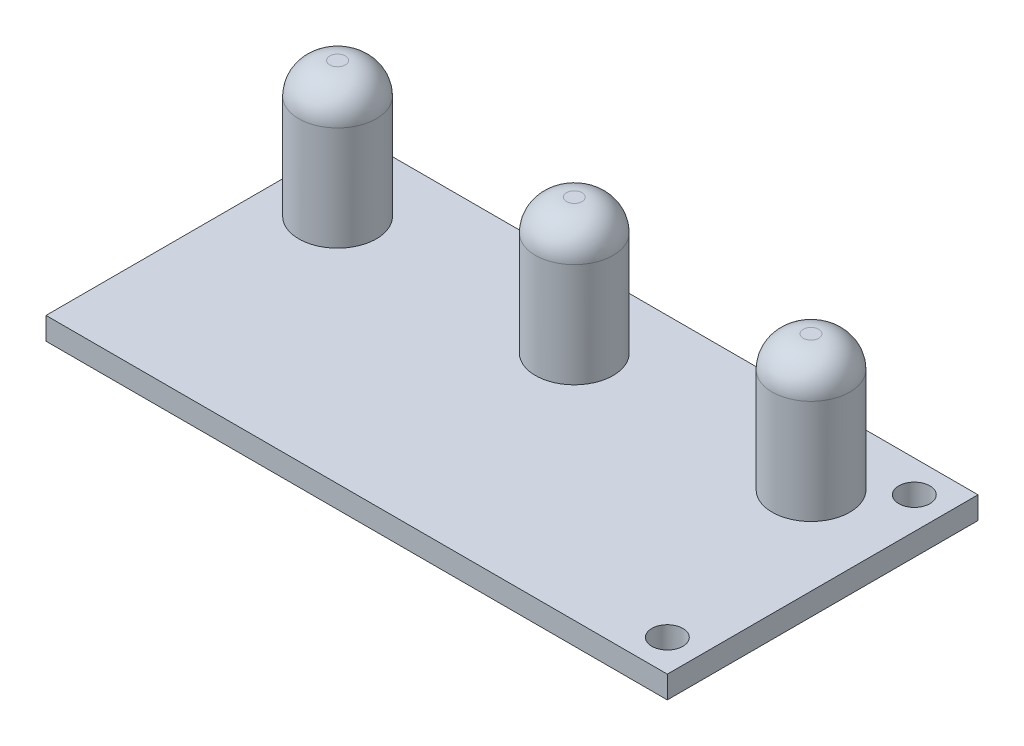
ISO-10303-21;
HEADER;
FILE_DESCRIPTION(('STEP AP214'),'2;1');
FILE_NAME('part.step','',(''),(''),'','','');
FILE_SCHEMA(('AUTOMOTIVE_DESIGN { 1 0 10303 214 1 1 1 1 }'));
ENDSEC;
DATA;
#1=APPLICATION_CONTEXT('core data for automotive mechanical design processes');
#2=APPLICATION_PROTOCOL_DEFINITION('international standard','automotive_design',2000,#1);
#3=PRODUCT_CONTEXT('',#1,'mechanical');
#4=PRODUCT('Part','Part','',(#3));
#5=PRODUCT_RELATED_PRODUCT_CATEGORY('part','',(#4));
#6=PRODUCT_DEFINITION_FORMATION('','',#4);
#7=PRODUCT_DEFINITION_CONTEXT('part definition',#1,'design');
#8=PRODUCT_DEFINITION('design','',#6,#7);
#9=PRODUCT_DEFINITION_SHAPE('','',#8);
#10=(LENGTH_UNIT() NAMED_UNIT(*) SI_UNIT(.MILLI.,.METRE.));
#11=(NAMED_UNIT(*) PLANE_ANGLE_UNIT() SI_UNIT($,.RADIAN.));
#12=(NAMED_UNIT(*) SI_UNIT($,.STERADIAN.) SOLID_ANGLE_UNIT());
#13=UNCERTAINTY_MEASURE_WITH_UNIT(LENGTH_MEASURE(1.E-05),#10,'distance_accuracy_value','');
#14=(GEOMETRIC_REPRESENTATION_CONTEXT(3) GLOBAL_UNCERTAINTY_ASSIGNED_CONTEXT((#13)) GLOBAL_UNIT_ASSIGNED_CONTEXT((#10,
#11,#12)) REPRESENTATION_CONTEXT('',''));
#15=CARTESIAN_POINT('',(0.,0.,0.));
#16=DIRECTION('',(0.,0.,1.));
#17=DIRECTION('',(1.,0.,0.));
#18=AXIS2_PLACEMENT_3D('',#15,#16,#17);
#19=CARTESIAN_POINT('',(20.,1.44,10.));
#20=DIRECTION('',(-1.,0.,0.));
#21=DIRECTION('',(0.,0.,1.));
#22=AXIS2_PLACEMENT_3D('',#19,#20,#21);
#23=PLANE('',#22);
#24=DIRECTION('',(0.,0.,-1.));
#25=VECTOR('',#24,1.);
#26=CARTESIAN_POINT('',(20.,0.,10.));
#27=LINE('',#26,#25);
#28=CARTESIAN_POINT('',(20.,0.,10.));
#29=VERTEX_POINT('',#28);
#30=CARTESIAN_POINT('',(20.,0.,-10.));
#31=VERTEX_POINT('',#30);
#32=EDGE_CURVE('E100',#29,#31,#27,.T.);
#33=ORIENTED_EDGE('',*,*,#32,.T.);
#34=DIRECTION('',(0.,-1.,0.));
#35=VECTOR('',#34,1.);
#36=CARTESIAN_POINT('',(20.,1.44,-10.));
#37=LINE('',#36,#35);
#38=CARTESIAN_POINT('',(20.,1.44,-10.));
#39=VERTEX_POINT('',#38);
#40=EDGE_CURVE('E91',#39,#31,#37,.T.);
#41=ORIENTED_EDGE('',*,*,#40,.F.);
#42=DIRECTION('',(0.,0.,-1.));
#43=VECTOR('',#42,1.);
#44=CARTESIAN_POINT('',(20.,1.44,10.));
#45=LINE('',#44,#43);
#46=CARTESIAN_POINT('',(20.,1.44,10.));
#47=VERTEX_POINT('',#46);
#48=EDGE_CURVE('E85',#47,#39,#45,.T.);
#49=ORIENTED_EDGE('',*,*,#48,.F.);
#50=DIRECTION('',(0.,-1.,0.));
#51=VECTOR('',#50,1.);
#52=CARTESIAN_POINT('',(20.,1.44,10.));
#53=LINE('',#52,#51);
#54=EDGE_CURVE('E96',#47,#29,#53,.T.);
#55=ORIENTED_EDGE('',*,*,#54,.T.);
#56=EDGE_LOOP('',(#33,#41,#49,#55));
#57=FACE_BOUND('',#56,.T.);
#58=ADVANCED_FACE('F32',(#57),#23,.F.);
#59=CARTESIAN_POINT('',(-20.,1.44,-10.));
#60=DIRECTION('',(0.,0.,1.));
#61=DIRECTION('',(1.,0.,0.));
#62=AXIS2_PLACEMENT_3D('',#59,#60,#61);
#63=PLANE('',#62);
#64=DIRECTION('',(-1.,0.,0.));
#65=VECTOR('',#64,1.);
#66=CARTESIAN_POINT('',(-20.,0.,-10.));
#67=LINE('',#66,#65);
#68=CARTESIAN_POINT('',(-20.,0.,-10.));
#69=VERTEX_POINT('',#68);
#70=EDGE_CURVE('E90',#31,#69,#67,.T.);
#71=ORIENTED_EDGE('',*,*,#70,.T.);
#72=DIRECTION('',(0.,-1.,0.));
#73=VECTOR('',#72,1.);
#74=CARTESIAN_POINT('',(-20.,1.44,-10.));
#75=LINE('',#74,#73);
#76=CARTESIAN_POINT('',(-20.,1.44,-10.));
#77=VERTEX_POINT('',#76);
#78=EDGE_CURVE('E88',#77,#69,#75,.T.);
#79=ORIENTED_EDGE('',*,*,#78,.F.);
#80=DIRECTION('',(-1.,0.,0.));
#81=VECTOR('',#80,1.);
#82=CARTESIAN_POINT('',(-20.,1.44,-10.));
#83=LINE('',#82,#81);
#84=EDGE_CURVE('E80',#39,#77,#83,.T.);
#85=ORIENTED_EDGE('',*,*,#84,.F.);
#86=ORIENTED_EDGE('',*,*,#40,.T.);
#87=EDGE_LOOP('',(#71,#79,#85,#86));
#88=FACE_BOUND('',#87,.T.);
#89=ADVANCED_FACE('F89',(#88),#63,.F.);
#90=CARTESIAN_POINT('',(-20.,1.44,10.));
#91=DIRECTION('',(1.,0.,0.));
#92=DIRECTION('',(0.,0.,-1.));
#93=AXIS2_PLACEMENT_3D('',#90,#91,#92);
#94=PLANE('',#93);
#95=DIRECTION('',(0.,0.,1.));
#96=VECTOR('',#95,1.);
#97=CARTESIAN_POINT('',(-20.,0.,10.));
#98=LINE('',#97,#96);
#99=CARTESIAN_POINT('',(-20.,0.,10.));
#100=VERTEX_POINT('',#99);
#101=EDGE_CURVE('E66',#69,#100,#98,.T.);
#102=ORIENTED_EDGE('',*,*,#101,.T.);
#103=DIRECTION('',(0.,-1.,0.));
#104=VECTOR('',#103,1.);
#105=CARTESIAN_POINT('',(-20.,1.44,10.));
#106=LINE('',#105,#104);
#107=CARTESIAN_POINT('',(-20.,1.44,10.));
#108=VERTEX_POINT('',#107);
#109=EDGE_CURVE('E92',#108,#100,#106,.T.);
#110=ORIENTED_EDGE('',*,*,#109,.F.);
#111=DIRECTION('',(0.,0.,1.));
#112=VECTOR('',#111,1.);
#113=CARTESIAN_POINT('',(-20.,1.44,10.));
#114=LINE('',#113,#112);
#115=EDGE_CURVE('E83',#77,#108,#114,.T.);
#116=ORIENTED_EDGE('',*,*,#115,.F.);
#117=ORIENTED_EDGE('',*,*,#78,.T.);
#118=EDGE_LOOP('',(#102,#110,#116,#117));
#119=FACE_BOUND('',#118,.T.);
#120=ADVANCED_FACE('F94',(#119),#94,.F.);
#121=CARTESIAN_POINT('',(-20.,1.44,10.));
#122=DIRECTION('',(0.,0.,-1.));
#123=DIRECTION('',(-1.,0.,0.));
#124=AXIS2_PLACEMENT_3D('',#121,#122,#123);
#125=PLANE('',#124);
#126=DIRECTION('',(1.,0.,0.));
#127=VECTOR('',#126,1.);
#128=CARTESIAN_POINT('',(-20.,0.,10.));
#129=LINE('',#128,#127);
#130=EDGE_CURVE('E72',#100,#29,#129,.T.);
#131=ORIENTED_EDGE('',*,*,#130,.T.);
#132=ORIENTED_EDGE('',*,*,#54,.F.);
#133=DIRECTION('',(1.,0.,0.));
#134=VECTOR('',#133,1.);
#135=CARTESIAN_POINT('',(-20.,1.44,10.));
#136=LINE('',#135,#134);
#137=EDGE_CURVE('E49',#108,#47,#136,.T.);
#138=ORIENTED_EDGE('',*,*,#137,.F.);
#139=ORIENTED_EDGE('',*,*,#109,.T.);
#140=EDGE_LOOP('',(#131,#132,#138,#139));
#141=FACE_BOUND('',#140,.T.);
#142=ADVANCED_FACE('F188',(#141),#125,.F.);
#143=CARTESIAN_POINT('',(0.,1.44,0.));
#144=DIRECTION('',(0.,-1.,0.));
#145=DIRECTION('',(0.,0.,-1.));
#146=AXIS2_PLACEMENT_3D('',#143,#144,#145);
#147=PLANE('',#146);
#148=CARTESIAN_POINT('',(17.95,1.44,-7.95));
#149=DIRECTION('',(0.,1.,0.));
#150=DIRECTION('',(0.,0.,1.));
#151=AXIS2_PLACEMENT_3D('',#148,#149,#150);
#152=CIRCLE('',#151,1.);
#153=CARTESIAN_POINT('',(17.95,1.44,-6.95));
#154=VERTEX_POINT('',#153);
#155=EDGE_CURVE('E286',#154,#154,#152,.T.);
#156=ORIENTED_EDGE('',*,*,#155,.F.);
#157=EDGE_LOOP('',(#156));
#158=FACE_BOUND('',#157,.T.);
#159=CARTESIAN_POINT('',(17.95,1.44,7.95));
#160=DIRECTION('',(0.,1.,0.));
#161=DIRECTION('',(0.,0.,1.));
#162=AXIS2_PLACEMENT_3D('',#159,#160,#161);
#163=CIRCLE('',#162,1.);
#164=CARTESIAN_POINT('',(17.95,1.44,8.95));
#165=VERTEX_POINT('',#164);
#166=EDGE_CURVE('E291',#165,#165,#163,.T.);
#167=ORIENTED_EDGE('',*,*,#166,.F.);
#168=EDGE_LOOP('',(#167));
#169=FACE_BOUND('',#168,.T.);
#170=CARTESIAN_POINT('',(-16.13,1.44,-4.9));
#171=DIRECTION('',(0.,-1.,0.));
#172=DIRECTION('',(0.,0.,-1.));
#173=AXIS2_PLACEMENT_3D('',#170,#171,#172);
#174=CIRCLE('',#173,2.5);
#175=CARTESIAN_POINT('',(-16.13,1.44,-7.4));
#176=VERTEX_POINT('',#175);
#177=EDGE_CURVE('E116',#176,#176,#174,.F.);
#178=ORIENTED_EDGE('',*,*,#177,.F.);
#179=EDGE_LOOP('',(#178));
#180=FACE_BOUND('',#179,.T.);
#181=CARTESIAN_POINT('',(-0.890000000000004,1.44,-4.9));
#182=DIRECTION('',(0.,-1.,0.));
#183=DIRECTION('',(0.,0.,-1.));
#184=AXIS2_PLACEMENT_3D('',#181,#182,#183);
#185=CIRCLE('',#184,2.5);
#186=CARTESIAN_POINT('',(-0.890000000000004,1.44,-7.4));
#187=VERTEX_POINT('',#186);
#188=EDGE_CURVE('E113',#187,#187,#185,.F.);
#189=ORIENTED_EDGE('',*,*,#188,.F.);
#190=EDGE_LOOP('',(#189));
#191=FACE_BOUND('',#190,.T.);
#192=CARTESIAN_POINT('',(14.35,1.44,-4.9));
#193=DIRECTION('',(0.,-1.,0.));
#194=DIRECTION('',(0.,0.,-1.));
#195=AXIS2_PLACEMENT_3D('',#192,#193,#194);
#196=CIRCLE('',#195,2.5);
#197=CARTESIAN_POINT('',(14.35,1.44,-7.4));
#198=VERTEX_POINT('',#197);
#199=EDGE_CURVE('E110',#198,#198,#196,.F.);
#200=ORIENTED_EDGE('',*,*,#199,.F.);
#201=EDGE_LOOP('',(#200));
#202=FACE_BOUND('',#201,.T.);
#203=ORIENTED_EDGE('',*,*,#48,.T.);
#204=ORIENTED_EDGE('',*,*,#84,.T.);
#205=ORIENTED_EDGE('',*,*,#115,.T.);
#206=ORIENTED_EDGE('',*,*,#137,.T.);
#207=EDGE_LOOP('',(#203,#204,#205,#206));
#208=FACE_BOUND('',#207,.T.);
#209=ADVANCED_FACE('F81',(#158,#169,#180,#191,#202,#208),#147,.F.);
#210=CARTESIAN_POINT('',(0.,0.,0.));
#211=DIRECTION('',(0.,-1.,0.));
#212=DIRECTION('',(0.,0.,-1.));
#213=AXIS2_PLACEMENT_3D('',#210,#211,#212);
#214=PLANE('',#213);
#215=CARTESIAN_POINT('',(17.95,0.,-7.95));
#216=DIRECTION('',(0.,1.,0.));
#217=DIRECTION('',(0.,0.,1.));
#218=AXIS2_PLACEMENT_3D('',#215,#216,#217);
#219=CIRCLE('',#218,1.);
#220=CARTESIAN_POINT('',(17.95,0.,-6.95));
#221=VERTEX_POINT('',#220);
#222=EDGE_CURVE('E103',#221,#221,#219,.T.);
#223=ORIENTED_EDGE('',*,*,#222,.T.);
#224=EDGE_LOOP('',(#223));
#225=FACE_BOUND('',#224,.T.);
#226=CARTESIAN_POINT('',(17.95,0.,7.95));
#227=DIRECTION('',(0.,1.,0.));
#228=DIRECTION('',(0.,0.,1.));
#229=AXIS2_PLACEMENT_3D('',#226,#227,#228);
#230=CIRCLE('',#229,1.);
#231=CARTESIAN_POINT('',(17.95,0.,8.95));
#232=VERTEX_POINT('',#231);
#233=EDGE_CURVE('E287',#232,#232,#230,.T.);
#234=ORIENTED_EDGE('',*,*,#233,.T.);
#235=EDGE_LOOP('',(#234));
#236=FACE_BOUND('',#235,.T.);
#237=ORIENTED_EDGE('',*,*,#32,.F.);
#238=ORIENTED_EDGE('',*,*,#130,.F.);
#239=ORIENTED_EDGE('',*,*,#101,.F.);
#240=ORIENTED_EDGE('',*,*,#70,.F.);
#241=EDGE_LOOP('',(#237,#238,#239,#240));
#242=FACE_BOUND('',#241,.T.);
#243=ADVANCED_FACE('F181',(#225,#236,#242),#214,.T.);
#244=CARTESIAN_POINT('',(14.35,10.14,-4.9));
#245=DIRECTION('',(0.,-1.,0.));
#246=DIRECTION('',(0.,0.,-1.));
#247=AXIS2_PLACEMENT_3D('',#244,#245,#246);
#248=CYLINDRICAL_SURFACE('',#247,2.5);
#249=CARTESIAN_POINT('',(14.35,8.14,-4.9));
#250=DIRECTION('',(0.,1.,0.));
#251=DIRECTION('',(0.,0.,1.));
#252=AXIS2_PLACEMENT_3D('',#249,#250,#251);
#253=CIRCLE('',#252,2.5);
#254=CARTESIAN_POINT('',(14.35,8.14,-2.4));
#255=VERTEX_POINT('',#254);
#256=EDGE_CURVE('E122',#255,#255,#253,.F.);
#257=ORIENTED_EDGE('',*,*,#256,.T.);
#258=EDGE_LOOP('',(#257));
#259=FACE_BOUND('',#258,.T.);
#260=ORIENTED_EDGE('',*,*,#199,.T.);
#261=EDGE_LOOP('',(#260));
#262=FACE_BOUND('',#261,.T.);
#263=ADVANCED_FACE('F172',(#259,#262),#248,.T.);
#264=CARTESIAN_POINT('',(14.35,10.14,-4.9));
#265=DIRECTION('',(0.,1.,0.));
#266=DIRECTION('',(0.,0.,1.));
#267=AXIS2_PLACEMENT_3D('',#264,#265,#266);
#268=PLANE('',#267);
#269=CARTESIAN_POINT('',(14.35,10.14,-4.9));
#270=DIRECTION('',(0.,1.,0.));
#271=DIRECTION('',(0.,0.,1.));
#272=AXIS2_PLACEMENT_3D('',#269,#270,#271);
#273=CIRCLE('',#272,0.499999999999997);
#274=CARTESIAN_POINT('',(14.35,10.14,-4.4));
#275=VERTEX_POINT('',#274);
#276=EDGE_CURVE('E119',#275,#275,#273,.T.);
#277=ORIENTED_EDGE('',*,*,#276,.T.);
#278=EDGE_LOOP('',(#277));
#279=FACE_BOUND('',#278,.T.);
#280=ADVANCED_FACE('F169',(#279),#268,.T.);
#281=CARTESIAN_POINT('',(-0.890000000000004,10.14,-4.9));
#282=DIRECTION('',(0.,-1.,0.));
#283=DIRECTION('',(0.,0.,-1.));
#284=AXIS2_PLACEMENT_3D('',#281,#282,#283);
#285=CYLINDRICAL_SURFACE('',#284,2.5);
#286=CARTESIAN_POINT('',(-0.890000000000004,8.14,-4.9));
#287=DIRECTION('',(0.,1.,0.));
#288=DIRECTION('',(0.,0.,1.));
#289=AXIS2_PLACEMENT_3D('',#286,#287,#288);
#290=CIRCLE('',#289,2.5);
#291=CARTESIAN_POINT('',(-0.890000000000004,8.14,-2.4));
#292=VERTEX_POINT('',#291);
#293=EDGE_CURVE('E128',#292,#292,#290,.F.);
#294=ORIENTED_EDGE('',*,*,#293,.T.);
#295=EDGE_LOOP('',(#294));
#296=FACE_BOUND('',#295,.T.);
#297=ORIENTED_EDGE('',*,*,#188,.T.);
#298=EDGE_LOOP('',(#297));
#299=FACE_BOUND('',#298,.T.);
#300=ADVANCED_FACE('F171',(#296,#299),#285,.T.);
#301=CARTESIAN_POINT('',(-0.890000000000004,10.14,-4.9));
#302=DIRECTION('',(0.,1.,0.));
#303=DIRECTION('',(0.,0.,1.));
#304=AXIS2_PLACEMENT_3D('',#301,#302,#303);
#305=PLANE('',#304);
#306=CARTESIAN_POINT('',(-0.890000000000004,10.14,-4.9));
#307=DIRECTION('',(0.,1.,0.));
#308=DIRECTION('',(0.,0.,1.));
#309=AXIS2_PLACEMENT_3D('',#306,#307,#308);
#310=CIRCLE('',#309,0.500000000000002);
#311=CARTESIAN_POINT('',(-0.890000000000004,10.14,-4.4));
#312=VERTEX_POINT('',#311);
#313=EDGE_CURVE('E125',#312,#312,#310,.T.);
#314=ORIENTED_EDGE('',*,*,#313,.T.);
#315=EDGE_LOOP('',(#314));
#316=FACE_BOUND('',#315,.T.);
#317=ADVANCED_FACE('F178',(#316),#305,.T.);
#318=CARTESIAN_POINT('',(-16.13,10.14,-4.9));
#319=DIRECTION('',(0.,-1.,0.));
#320=DIRECTION('',(0.,0.,-1.));
#321=AXIS2_PLACEMENT_3D('',#318,#319,#320);
#322=CYLINDRICAL_SURFACE('',#321,2.5);
#323=CARTESIAN_POINT('',(-16.13,8.14,-4.9));
#324=DIRECTION('',(0.,1.,0.));
#325=DIRECTION('',(0.,0.,1.));
#326=AXIS2_PLACEMENT_3D('',#323,#324,#325);
#327=CIRCLE('',#326,2.5);
#328=CARTESIAN_POINT('',(-16.13,8.14,-2.4));
#329=VERTEX_POINT('',#328);
#330=EDGE_CURVE('E11',#329,#329,#327,.F.);
#331=ORIENTED_EDGE('',*,*,#330,.T.);
#332=EDGE_LOOP('',(#331));
#333=FACE_BOUND('',#332,.T.);
#334=ORIENTED_EDGE('',*,*,#177,.T.);
#335=EDGE_LOOP('',(#334));
#336=FACE_BOUND('',#335,.T.);
#337=ADVANCED_FACE('F163',(#333,#336),#322,.T.);
#338=CARTESIAN_POINT('',(-16.13,10.14,-4.9));
#339=DIRECTION('',(0.,1.,0.));
#340=DIRECTION('',(0.,0.,1.));
#341=AXIS2_PLACEMENT_3D('',#338,#339,#340);
#342=PLANE('',#341);
#343=CARTESIAN_POINT('',(-16.13,10.14,-4.9));
#344=DIRECTION('',(0.,1.,0.));
#345=DIRECTION('',(0.,0.,1.));
#346=AXIS2_PLACEMENT_3D('',#343,#344,#345);
#347=CIRCLE('',#346,0.500000000000002);
#348=CARTESIAN_POINT('',(-16.13,10.14,-4.4));
#349=VERTEX_POINT('',#348);
#350=EDGE_CURVE('E41',#349,#349,#347,.T.);
#351=ORIENTED_EDGE('',*,*,#350,.T.);
#352=EDGE_LOOP('',(#351));
#353=FACE_BOUND('',#352,.T.);
#354=ADVANCED_FACE('F133',(#353),#342,.T.);
#355=CARTESIAN_POINT('',(14.35,8.14,-4.9));
#356=DIRECTION('',(0.,1.,0.));
#357=DIRECTION('',(0.,0.,1.));
#358=AXIS2_PLACEMENT_3D('',#355,#356,#357);
#359=DEGENERATE_TOROIDAL_SURFACE('',#358,0.499999999999997,2.,.T.);
#360=ORIENTED_EDGE('',*,*,#256,.F.);
#361=EDGE_LOOP('',(#360));
#362=FACE_BOUND('',#361,.T.);
#363=ORIENTED_EDGE('',*,*,#276,.F.);
#364=EDGE_LOOP('',(#363));
#365=FACE_BOUND('',#364,.T.);
#366=ADVANCED_FACE('F146',(#362,#365),#359,.T.);
#367=CARTESIAN_POINT('',(-0.890000000000004,8.14,-4.9));
#368=DIRECTION('',(0.,1.,0.));
#369=DIRECTION('',(0.,0.,1.));
#370=AXIS2_PLACEMENT_3D('',#367,#368,#369);
#371=DEGENERATE_TOROIDAL_SURFACE('',#370,0.500000000000002,2.,.T.);
#372=ORIENTED_EDGE('',*,*,#293,.F.);
#373=EDGE_LOOP('',(#372));
#374=FACE_BOUND('',#373,.T.);
#375=ORIENTED_EDGE('',*,*,#313,.F.);
#376=EDGE_LOOP('',(#375));
#377=FACE_BOUND('',#376,.T.);
#378=ADVANCED_FACE('F137',(#374,#377),#371,.T.);
#379=CARTESIAN_POINT('',(-16.13,8.14,-4.9));
#380=DIRECTION('',(0.,1.,0.));
#381=DIRECTION('',(0.,0.,1.));
#382=AXIS2_PLACEMENT_3D('',#379,#380,#381);
#383=DEGENERATE_TOROIDAL_SURFACE('',#382,0.500000000000002,2.,.T.);
#384=ORIENTED_EDGE('',*,*,#330,.F.);
#385=EDGE_LOOP('',(#384));
#386=FACE_BOUND('',#385,.T.);
#387=ORIENTED_EDGE('',*,*,#350,.F.);
#388=EDGE_LOOP('',(#387));
#389=FACE_BOUND('',#388,.T.);
#390=ADVANCED_FACE('F34',(#386,#389),#383,.T.);
#391=CARTESIAN_POINT('',(17.95,0.,7.95));
#392=DIRECTION('',(0.,1.,0.));
#393=DIRECTION('',(0.,0.,1.));
#394=AXIS2_PLACEMENT_3D('',#391,#392,#393);
#395=CYLINDRICAL_SURFACE('',#394,1.);
#396=CARTESIAN_POINT('',(17.95,0.,8.95));
#397=CARTESIAN_POINT('',(17.95,0.015,8.95));
#398=CARTESIAN_POINT('',(17.95,0.03,8.95));
#399=CARTESIAN_POINT('',(17.95,0.06,8.95));
#400=CARTESIAN_POINT('',(17.95,0.075,8.95));
#401=CARTESIAN_POINT('',(17.95,0.105,8.95));
#402=CARTESIAN_POINT('',(17.95,0.12,8.95));
#403=CARTESIAN_POINT('',(17.95,0.15,8.95));
#404=CARTESIAN_POINT('',(17.95,0.165,8.95));
#405=CARTESIAN_POINT('',(17.95,0.195,8.95));
#406=CARTESIAN_POINT('',(17.95,0.21,8.95));
#407=CARTESIAN_POINT('',(17.95,0.24,8.95));
#408=CARTESIAN_POINT('',(17.95,0.255,8.95));
#409=CARTESIAN_POINT('',(17.95,0.285,8.95));
#410=CARTESIAN_POINT('',(17.95,0.3,8.95));
#411=CARTESIAN_POINT('',(17.95,0.33,8.95));
#412=CARTESIAN_POINT('',(17.95,0.345,8.95));
#413=CARTESIAN_POINT('',(17.95,0.375,8.95));
#414=CARTESIAN_POINT('',(17.95,0.39,8.95));
#415=CARTESIAN_POINT('',(17.95,0.42,8.95));
#416=CARTESIAN_POINT('',(17.95,0.435,8.95));
#417=CARTESIAN_POINT('',(17.95,0.465,8.95));
#418=CARTESIAN_POINT('',(17.95,0.48,8.95));
#419=CARTESIAN_POINT('',(17.95,0.51,8.95));
#420=CARTESIAN_POINT('',(17.95,0.525,8.95));
#421=CARTESIAN_POINT('',(17.95,0.555,8.95));
#422=CARTESIAN_POINT('',(17.95,0.57,8.95));
#423=CARTESIAN_POINT('',(17.95,0.6,8.95));
#424=CARTESIAN_POINT('',(17.95,0.615,8.95));
#425=CARTESIAN_POINT('',(17.95,0.645,8.95));
#426=CARTESIAN_POINT('',(17.95,0.66,8.95));
#427=CARTESIAN_POINT('',(17.95,0.69,8.95));
#428=CARTESIAN_POINT('',(17.95,0.705,8.95));
#429=CARTESIAN_POINT('',(17.95,0.735,8.95));
#430=CARTESIAN_POINT('',(17.95,0.75,8.95));
#431=CARTESIAN_POINT('',(17.95,0.78,8.95));
#432=CARTESIAN_POINT('',(17.95,0.795,8.95));
#433=CARTESIAN_POINT('',(17.95,0.825,8.95));
#434=CARTESIAN_POINT('',(17.95,0.84,8.95));
#435=CARTESIAN_POINT('',(17.95,0.87,8.95));
#436=CARTESIAN_POINT('',(17.95,0.885,8.95));
#437=CARTESIAN_POINT('',(17.95,0.915,8.95));
#438=CARTESIAN_POINT('',(17.95,0.93,8.95));
#439=CARTESIAN_POINT('',(17.95,0.96,8.95));
#440=CARTESIAN_POINT('',(17.95,0.975,8.95));
#441=CARTESIAN_POINT('',(17.95,1.005,8.95));
#442=CARTESIAN_POINT('',(17.95,1.02,8.95));
#443=CARTESIAN_POINT('',(17.95,1.05,8.95));
#444=CARTESIAN_POINT('',(17.95,1.065,8.95));
#445=CARTESIAN_POINT('',(17.95,1.095,8.95));
#446=CARTESIAN_POINT('',(17.95,1.11,8.95));
#447=CARTESIAN_POINT('',(17.95,1.14,8.95));
#448=CARTESIAN_POINT('',(17.95,1.155,8.95));
#449=CARTESIAN_POINT('',(17.95,1.185,8.95));
#450=CARTESIAN_POINT('',(17.95,1.2,8.95));
#451=CARTESIAN_POINT('',(17.95,1.23,8.95));
#452=CARTESIAN_POINT('',(17.95,1.245,8.95));
#453=CARTESIAN_POINT('',(17.95,1.275,8.95));
#454=CARTESIAN_POINT('',(17.95,1.29,8.95));
#455=CARTESIAN_POINT('',(17.95,1.32,8.95));
#456=CARTESIAN_POINT('',(17.95,1.335,8.95));
#457=CARTESIAN_POINT('',(17.95,1.365,8.95));
#458=CARTESIAN_POINT('',(17.95,1.38,8.95));
#459=CARTESIAN_POINT('',(17.95,1.41,8.95));
#460=CARTESIAN_POINT('',(17.95,1.425,8.95));
#461=CARTESIAN_POINT('',(17.95,1.44,8.95));
#462=B_SPLINE_CURVE_WITH_KNOTS('',3,(#396,#397,#398,#399,#400,#401,#402,#403,#404,#405,#406,
#407,#408,#409,#410,#411,#412,#413,#414,#415,#416,#417,#418,#419,#420,#421,#422,#423,#424,#425,
#426,#427,#428,#429,#430,#431,#432,#433,#434,#435,#436,#437,#438,#439,#440,#441,#442,#443,#444,
#445,#446,#447,#448,#449,#450,#451,#452,#453,#454,#455,#456,#457,#458,#459,#460,#461),
.UNSPECIFIED.,.F.,.F.,(4,2,2,2,2,2,2,2,2,2,2,2,2,2,2,2,2,2,2,2,2,2,2,2,2,2,2,2,2,2,2,2,4),(0.,
0.045,0.09,0.135,0.18,0.225,0.27,0.315,0.36,0.405,0.45,0.495,0.54,0.585,0.63,0.675,0.72,0.765,
0.81,0.855,0.9,0.945,0.99,1.035,1.08,1.125,1.17,1.215,1.26,1.305,1.35,1.395,1.44),.UNSPECIFIED.);
#463=EDGE_CURVE('BSEAM136',#232,#165,#462,.T.);
#464=ORIENTED_EDGE('',*,*,#233,.F.);
#465=ORIENTED_EDGE('',*,*,#166,.T.);
#466=ORIENTED_EDGE('',*,*,#463,.T.);
#467=ORIENTED_EDGE('',*,*,#463,.F.);
#468=EDGE_LOOP('',(#464,#466,#465,#467));
#469=FACE_BOUND('',#468,.T.);
#470=ADVANCED_FACE('F136',(#469),#395,.F.);
#471=CARTESIAN_POINT('',(17.95,0.,-7.95));
#472=DIRECTION('',(0.,1.,0.));
#473=DIRECTION('',(0.,0.,1.));
#474=AXIS2_PLACEMENT_3D('',#471,#472,#473);
#475=CYLINDRICAL_SURFACE('',#474,1.);
#476=CARTESIAN_POINT('',(17.95,0.,-6.95));
#477=CARTESIAN_POINT('',(17.95,0.015,-6.95));
#478=CARTESIAN_POINT('',(17.95,0.03,-6.95));
#479=CARTESIAN_POINT('',(17.95,0.06,-6.95));
#480=CARTESIAN_POINT('',(17.95,0.075,-6.95));
#481=CARTESIAN_POINT('',(17.95,0.105,-6.95));
#482=CARTESIAN_POINT('',(17.95,0.12,-6.95));
#483=CARTESIAN_POINT('',(17.95,0.15,-6.95));
#484=CARTESIAN_POINT('',(17.95,0.165,-6.95));
#485=CARTESIAN_POINT('',(17.95,0.195,-6.95));
#486=CARTESIAN_POINT('',(17.95,0.21,-6.95));
#487=CARTESIAN_POINT('',(17.95,0.24,-6.95));
#488=CARTESIAN_POINT('',(17.95,0.255,-6.95));
#489=CARTESIAN_POINT('',(17.95,0.285,-6.95));
#490=CARTESIAN_POINT('',(17.95,0.3,-6.95));
#491=CARTESIAN_POINT('',(17.95,0.33,-6.95));
#492=CARTESIAN_POINT('',(17.95,0.345,-6.95));
#493=CARTESIAN_POINT('',(17.95,0.375,-6.95));
#494=CARTESIAN_POINT('',(17.95,0.39,-6.95));
#495=CARTESIAN_POINT('',(17.95,0.42,-6.95));
#496=CARTESIAN_POINT('',(17.95,0.435,-6.95));
#497=CARTESIAN_POINT('',(17.95,0.465,-6.95));
#498=CARTESIAN_POINT('',(17.95,0.48,-6.95));
#499=CARTESIAN_POINT('',(17.95,0.51,-6.95));
#500=CARTESIAN_POINT('',(17.95,0.525,-6.95));
#501=CARTESIAN_POINT('',(17.95,0.555,-6.95));
#502=CARTESIAN_POINT('',(17.95,0.57,-6.95));
#503=CARTESIAN_POINT('',(17.95,0.6,-6.95));
#504=CARTESIAN_POINT('',(17.95,0.615,-6.95));
#505=CARTESIAN_POINT('',(17.95,0.645,-6.95));
#506=CARTESIAN_POINT('',(17.95,0.66,-6.95));
#507=CARTESIAN_POINT('',(17.95,0.69,-6.95));
#508=CARTESIAN_POINT('',(17.95,0.705,-6.95));
#509=CARTESIAN_POINT('',(17.95,0.735,-6.95));
#510=CARTESIAN_POINT('',(17.95,0.75,-6.95));
#511=CARTESIAN_POINT('',(17.95,0.78,-6.95));
#512=CARTESIAN_POINT('',(17.95,0.795,-6.95));
#513=CARTESIAN_POINT('',(17.95,0.825,-6.95));
#514=CARTESIAN_POINT('',(17.95,0.84,-6.95));
#515=CARTESIAN_POINT('',(17.95,0.87,-6.95));
#516=CARTESIAN_POINT('',(17.95,0.885,-6.95));
#517=CARTESIAN_POINT('',(17.95,0.915,-6.95));
#518=CARTESIAN_POINT('',(17.95,0.93,-6.95));
#519=CARTESIAN_POINT('',(17.95,0.96,-6.95));
#520=CARTESIAN_POINT('',(17.95,0.975,-6.95));
#521=CARTESIAN_POINT('',(17.95,1.005,-6.95));
#522=CARTESIAN_POINT('',(17.95,1.02,-6.95));
#523=CARTESIAN_POINT('',(17.95,1.05,-6.95));
#524=CARTESIAN_POINT('',(17.95,1.065,-6.95));
#525=CARTESIAN_POINT('',(17.95,1.095,-6.95));
#526=CARTESIAN_POINT('',(17.95,1.11,-6.95));
#527=CARTESIAN_POINT('',(17.95,1.14,-6.95));
#528=CARTESIAN_POINT('',(17.95,1.155,-6.95));
#529=CARTESIAN_POINT('',(17.95,1.185,-6.95));
#530=CARTESIAN_POINT('',(17.95,1.2,-6.95));
#531=CARTESIAN_POINT('',(17.95,1.23,-6.95));
#532=CARTESIAN_POINT('',(17.95,1.245,-6.95));
#533=CARTESIAN_POINT('',(17.95,1.275,-6.95));
#534=CARTESIAN_POINT('',(17.95,1.29,-6.95));
#535=CARTESIAN_POINT('',(17.95,1.32,-6.95));
#536=CARTESIAN_POINT('',(17.95,1.335,-6.95));
#537=CARTESIAN_POINT('',(17.95,1.365,-6.95));
#538=CARTESIAN_POINT('',(17.95,1.38,-6.95));
#539=CARTESIAN_POINT('',(17.95,1.41,-6.95));
#540=CARTESIAN_POINT('',(17.95,1.425,-6.95));
#541=CARTESIAN_POINT('',(17.95,1.44,-6.95));
#542=B_SPLINE_CURVE_WITH_KNOTS('',3,(#476,#477,#478,#479,#480,#481,#482,#483,#484,#485,#486,
#487,#488,#489,#490,#491,#492,#493,#494,#495,#496,#497,#498,#499,#500,#501,#502,#503,#504,#505,
#506,#507,#508,#509,#510,#511,#512,#513,#514,#515,#516,#517,#518,#519,#520,#521,#522,#523,#524,
#525,#526,#527,#528,#529,#530,#531,#532,#533,#534,#535,#536,#537,#538,#539,#540,#541),
.UNSPECIFIED.,.F.,.F.,(4,2,2,2,2,2,2,2,2,2,2,2,2,2,2,2,2,2,2,2,2,2,2,2,2,2,2,2,2,2,2,2,4),(0.,
0.045,0.09,0.135,0.18,0.225,0.27,0.315,0.36,0.405,0.45,0.495,0.54,0.585,0.63,0.675,0.72,0.765,
0.81,0.855,0.9,0.945,0.99,1.035,1.08,1.125,1.17,1.215,1.26,1.305,1.35,1.395,1.44),.UNSPECIFIED.);
#543=EDGE_CURVE('BSEAM143',#221,#154,#542,.T.);
#544=ORIENTED_EDGE('',*,*,#222,.F.);
#545=ORIENTED_EDGE('',*,*,#155,.T.);
#546=ORIENTED_EDGE('',*,*,#543,.T.);
#547=ORIENTED_EDGE('',*,*,#543,.F.);
#548=EDGE_LOOP('',(#544,#546,#545,#547));
#549=FACE_BOUND('',#548,.T.);
#550=ADVANCED_FACE('F143',(#549),#475,.F.);
#551=CLOSED_SHELL('',(#58,#89,#120,#142,#209,#243,#263,#280,#300,#317,#337,#354,#366,#378,#390,
#470,#550));
#552=MANIFOLD_SOLID_BREP('B2',#551);
#553=ADVANCED_BREP_SHAPE_REPRESENTATION('',(#18,#552),#14);
#554=SHAPE_DEFINITION_REPRESENTATION(#9,#553);
ENDSEC;
END-ISO-10303-21;
